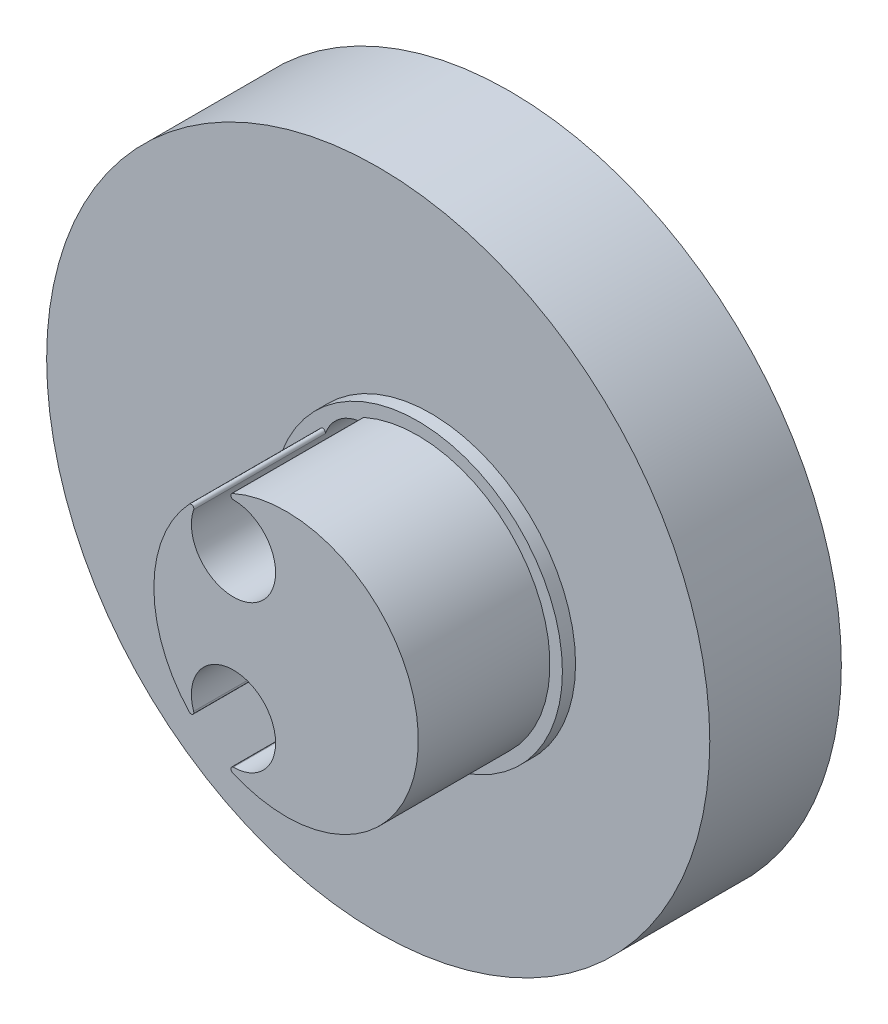
ISO-10303-21;
HEADER;
FILE_DESCRIPTION(('STEP AP214'),'2;1');
FILE_NAME('part.step','',(''),(''),'','','');
FILE_SCHEMA(('AUTOMOTIVE_DESIGN { 1 0 10303 214 1 1 1 1 }'));
ENDSEC;
DATA;
#1=APPLICATION_CONTEXT('core data for automotive mechanical design processes');
#2=APPLICATION_PROTOCOL_DEFINITION('international standard','automotive_design',2000,#1);
#3=PRODUCT_CONTEXT('',#1,'mechanical');
#4=PRODUCT('Part','Part','',(#3));
#5=PRODUCT_RELATED_PRODUCT_CATEGORY('part','',(#4));
#6=PRODUCT_DEFINITION_FORMATION('','',#4);
#7=PRODUCT_DEFINITION_CONTEXT('part definition',#1,'design');
#8=PRODUCT_DEFINITION('design','',#6,#7);
#9=PRODUCT_DEFINITION_SHAPE('','',#8);
#10=(LENGTH_UNIT() NAMED_UNIT(*) SI_UNIT(.MILLI.,.METRE.));
#11=(NAMED_UNIT(*) PLANE_ANGLE_UNIT() SI_UNIT($,.RADIAN.));
#12=(NAMED_UNIT(*) SI_UNIT($,.STERADIAN.) SOLID_ANGLE_UNIT());
#13=UNCERTAINTY_MEASURE_WITH_UNIT(LENGTH_MEASURE(1.E-05),#10,'distance_accuracy_value','');
#14=(GEOMETRIC_REPRESENTATION_CONTEXT(3) GLOBAL_UNCERTAINTY_ASSIGNED_CONTEXT((#13)) GLOBAL_UNIT_ASSIGNED_CONTEXT((#10,
#11,#12)) REPRESENTATION_CONTEXT('',''));
#15=CARTESIAN_POINT('',(0.,0.,0.));
#16=DIRECTION('',(0.,0.,1.));
#17=DIRECTION('',(1.,0.,0.));
#18=AXIS2_PLACEMENT_3D('',#15,#16,#17);
#19=CARTESIAN_POINT('',(0.,0.,8.5));
#20=DIRECTION('',(0.,0.,1.));
#21=DIRECTION('',(1.,0.,0.));
#22=AXIS2_PLACEMENT_3D('',#19,#20,#21);
#23=PLANE('',#22);
#24=CARTESIAN_POINT('',(0.,-2.8,8.5));
#25=DIRECTION('',(0.,0.,1.));
#26=DIRECTION('',(1.,0.,0.));
#27=AXIS2_PLACEMENT_3D('',#24,#25,#26);
#28=CIRCLE('',#27,1.6);
#29=CARTESIAN_POINT('',(-1.51308349346044,-3.32017145425094,8.5));
#30=VERTEX_POINT('',#29);
#31=CARTESIAN_POINT('',(-0.00132429668263966,-4.39999945194937,8.5));
#32=VERTEX_POINT('',#31);
#33=EDGE_CURVE('E152',#30,#32,#28,.F.);
#34=ORIENTED_EDGE('',*,*,#33,.T.);
#35=CARTESIAN_POINT('',(-0.00140706522530469,-4.49999941769621,8.5));
#36=DIRECTION('',(0.,0.,1.));
#37=DIRECTION('',(1.,0.,0.));
#38=AXIS2_PLACEMENT_3D('',#35,#36,#37);
#39=CIRCLE('',#38,0.1);
#40=CARTESIAN_POINT('',(-0.0420447721334329,-4.59136996424842,8.5));
#41=VERTEX_POINT('',#40);
#42=EDGE_CURVE('E166',#32,#41,#39,.T.);
#43=ORIENTED_EDGE('',*,*,#42,.T.);
#44=CARTESIAN_POINT('',(2.,0.,8.5));
#45=DIRECTION('',(0.,0.,1.));
#46=DIRECTION('',(1.,0.,0.));
#47=AXIS2_PLACEMENT_3D('',#44,#45,#46);
#48=CIRCLE('',#47,5.025);
#49=CARTESIAN_POINT('',(-0.0420447721334338,4.59136996424842,8.5));
#50=VERTEX_POINT('',#49);
#51=EDGE_CURVE('E121',#41,#50,#48,.T.);
#52=ORIENTED_EDGE('',*,*,#51,.T.);
#53=CARTESIAN_POINT('',(-0.00140706522530566,4.49999941769621,8.5));
#54=DIRECTION('',(0.,0.,1.));
#55=DIRECTION('',(1.,0.,0.));
#56=AXIS2_PLACEMENT_3D('',#53,#54,#55);
#57=CIRCLE('',#56,0.1);
#58=CARTESIAN_POINT('',(-0.00132429668264062,4.39999945194937,8.5));
#59=VERTEX_POINT('',#58);
#60=EDGE_CURVE('E162',#50,#59,#57,.T.);
#61=ORIENTED_EDGE('',*,*,#60,.T.);
#62=CARTESIAN_POINT('',(0.,2.8,8.5));
#63=DIRECTION('',(0.,0.,1.));
#64=DIRECTION('',(1.,0.,0.));
#65=AXIS2_PLACEMENT_3D('',#62,#63,#64);
#66=CIRCLE('',#65,1.6);
#67=CARTESIAN_POINT('',(-1.51308349346044,3.32017145425094,8.5));
#68=VERTEX_POINT('',#67);
#69=EDGE_CURVE('E149',#59,#68,#66,.F.);
#70=ORIENTED_EDGE('',*,*,#69,.T.);
#71=CARTESIAN_POINT('',(-1.60765121180172,3.35268217014163,8.5));
#72=DIRECTION('',(0.,0.,1.));
#73=DIRECTION('',(1.,0.,0.));
#74=AXIS2_PLACEMENT_3D('',#71,#72,#73);
#75=CIRCLE('',#74,0.1);
#76=CARTESIAN_POINT('',(-1.68090301305658,3.4207569350176,8.5));
#77=VERTEX_POINT('',#76);
#78=EDGE_CURVE('E160',#68,#77,#75,.T.);
#79=ORIENTED_EDGE('',*,*,#78,.T.);
#80=CARTESIAN_POINT('',(-1.68090301305658,-3.4207569350176,8.5));
#81=VERTEX_POINT('',#80);
#82=EDGE_CURVE('E146',#77,#81,#48,.T.);
#83=ORIENTED_EDGE('',*,*,#82,.T.);
#84=CARTESIAN_POINT('',(-1.60765121180172,-3.35268217014163,8.5));
#85=DIRECTION('',(0.,0.,1.));
#86=DIRECTION('',(1.,0.,0.));
#87=AXIS2_PLACEMENT_3D('',#84,#85,#86);
#88=CIRCLE('',#87,0.1);
#89=EDGE_CURVE('E164',#81,#30,#88,.T.);
#90=ORIENTED_EDGE('',*,*,#89,.T.);
#91=EDGE_LOOP('',(#34,#43,#52,#61,#70,#79,#83,#90));
#92=FACE_BOUND('',#91,.T.);
#93=ADVANCED_FACE('F41',(#92),#23,.T.);
#94=CARTESIAN_POINT('',(0.,0.,3.));
#95=DIRECTION('',(0.,0.,1.));
#96=DIRECTION('',(1.,0.,0.));
#97=AXIS2_PLACEMENT_3D('',#94,#95,#96);
#98=PLANE('',#97);
#99=CARTESIAN_POINT('',(2.,0.,3.));
#100=DIRECTION('',(0.,0.,1.));
#101=DIRECTION('',(1.,0.,0.));
#102=AXIS2_PLACEMENT_3D('',#99,#100,#101);
#103=CIRCLE('',#102,5.49945445757595);
#104=CARTESIAN_POINT('',(7.49945445757595,0.,3.));
#105=VERTEX_POINT('',#104);
#106=EDGE_CURVE('E128',#105,#105,#103,.T.);
#107=ORIENTED_EDGE('',*,*,#106,.F.);
#108=EDGE_LOOP('',(#107));
#109=FACE_BOUND('',#108,.T.);
#110=CARTESIAN_POINT('',(0.,0.,3.));
#111=DIRECTION('',(0.,0.,1.));
#112=DIRECTION('',(1.,0.,0.));
#113=AXIS2_PLACEMENT_3D('',#110,#111,#112);
#114=CIRCLE('',#113,12.6);
#115=CARTESIAN_POINT('',(12.6,0.,3.));
#116=VERTEX_POINT('',#115);
#117=EDGE_CURVE('E155',#116,#116,#114,.F.);
#118=ORIENTED_EDGE('',*,*,#117,.F.);
#119=EDGE_LOOP('',(#118));
#120=FACE_BOUND('',#119,.T.);
#121=ADVANCED_FACE('F205',(#109,#120),#98,.T.);
#122=CARTESIAN_POINT('',(2.,0.,3.5));
#123=DIRECTION('',(0.,0.,-1.));
#124=DIRECTION('',(-1.,0.,0.));
#125=AXIS2_PLACEMENT_3D('',#122,#123,#124);
#126=CYLINDRICAL_SURFACE('',#125,5.49945445757595);
#127=CARTESIAN_POINT('',(2.,0.,3.5));
#128=DIRECTION('',(0.,0.,1.));
#129=DIRECTION('',(1.,0.,0.));
#130=AXIS2_PLACEMENT_3D('',#127,#128,#129);
#131=CIRCLE('',#130,5.49945445757595);
#132=CARTESIAN_POINT('',(7.49945445757595,0.,3.5));
#133=VERTEX_POINT('',#132);
#134=EDGE_CURVE('E134',#133,#133,#131,.T.);
#135=ORIENTED_EDGE('',*,*,#134,.F.);
#136=EDGE_LOOP('',(#135));
#137=FACE_BOUND('',#136,.T.);
#138=ORIENTED_EDGE('',*,*,#106,.T.);
#139=EDGE_LOOP('',(#138));
#140=FACE_BOUND('',#139,.T.);
#141=ADVANCED_FACE('F208',(#137,#140),#126,.T.);
#142=CARTESIAN_POINT('',(0.,0.,38.638181771802));
#143=DIRECTION('',(0.,0.,-1.));
#144=DIRECTION('',(-1.,0.,0.));
#145=AXIS2_PLACEMENT_3D('',#142,#143,#144);
#146=CYLINDRICAL_SURFACE('',#145,12.6);
#147=CARTESIAN_POINT('',(0.,0.,-2.));
#148=DIRECTION('',(0.,0.,-1.));
#149=DIRECTION('',(-1.,0.,0.));
#150=AXIS2_PLACEMENT_3D('',#147,#148,#149);
#151=CIRCLE('',#150,12.6);
#152=CARTESIAN_POINT('',(-12.6,0.,-2.));
#153=VERTEX_POINT('',#152);
#154=EDGE_CURVE('E329',#153,#153,#151,.T.);
#155=ORIENTED_EDGE('',*,*,#154,.F.);
#156=EDGE_LOOP('',(#155));
#157=FACE_BOUND('',#156,.T.);
#158=ORIENTED_EDGE('',*,*,#117,.T.);
#159=EDGE_LOOP('',(#158));
#160=FACE_BOUND('',#159,.T.);
#161=ADVANCED_FACE('F214',(#157,#160),#146,.T.);
#162=CARTESIAN_POINT('',(2.,0.,8.5));
#163=DIRECTION('',(0.,0.,-1.));
#164=DIRECTION('',(-1.,0.,0.));
#165=AXIS2_PLACEMENT_3D('',#162,#163,#164);
#166=CYLINDRICAL_SURFACE('',#165,5.025);
#167=CARTESIAN_POINT('',(2.,0.,3.5));
#168=DIRECTION('',(0.,0.,1.));
#169=DIRECTION('',(1.,0.,0.));
#170=AXIS2_PLACEMENT_3D('',#167,#168,#169);
#171=CIRCLE('',#170,5.025);
#172=CARTESIAN_POINT('',(-1.68090301305658,3.4207569350176,3.5));
#173=VERTEX_POINT('',#172);
#174=CARTESIAN_POINT('',(-1.68090301305658,-3.4207569350176,3.5));
#175=VERTEX_POINT('',#174);
#176=EDGE_CURVE('E129',#173,#175,#171,.T.);
#177=ORIENTED_EDGE('',*,*,#176,.T.);
#178=DIRECTION('',(0.,0.,-1.));
#179=VECTOR('',#178,1.);
#180=CARTESIAN_POINT('',(-1.68090301305658,-3.4207569350176,8.5));
#181=LINE('',#180,#179);
#182=EDGE_CURVE('E171',#175,#81,#181,.F.);
#183=ORIENTED_EDGE('',*,*,#182,.T.);
#184=ORIENTED_EDGE('',*,*,#82,.F.);
#185=DIRECTION('',(0.,0.,-1.));
#186=VECTOR('',#185,1.);
#187=CARTESIAN_POINT('',(-1.68090301305658,3.4207569350176,8.5));
#188=LINE('',#187,#186);
#189=EDGE_CURVE('E168',#77,#173,#188,.T.);
#190=ORIENTED_EDGE('',*,*,#189,.T.);
#191=EDGE_LOOP('',(#177,#183,#184,#190));
#192=FACE_BOUND('',#191,.T.);
#193=ADVANCED_FACE('F183',(#192),#166,.T.);
#194=CARTESIAN_POINT('',(0.,0.,3.5));
#195=DIRECTION('',(0.,0.,1.));
#196=DIRECTION('',(1.,0.,0.));
#197=AXIS2_PLACEMENT_3D('',#194,#195,#196);
#198=PLANE('',#197);
#199=CARTESIAN_POINT('',(0.,2.8,3.5));
#200=DIRECTION('',(0.,0.,1.));
#201=DIRECTION('',(1.,0.,0.));
#202=AXIS2_PLACEMENT_3D('',#199,#200,#201);
#203=CIRCLE('',#202,1.6);
#204=CARTESIAN_POINT('',(-0.00132429668264062,4.39999945194937,3.5));
#205=VERTEX_POINT('',#204);
#206=CARTESIAN_POINT('',(-1.51308349346044,3.32017145425094,3.5));
#207=VERTEX_POINT('',#206);
#208=EDGE_CURVE('E55',#205,#207,#203,.T.);
#209=ORIENTED_EDGE('',*,*,#208,.F.);
#210=CARTESIAN_POINT('',(-0.00140706522530566,4.49999941769621,3.5));
#211=DIRECTION('',(0.,0.,1.));
#212=DIRECTION('',(1.,0.,0.));
#213=AXIS2_PLACEMENT_3D('',#210,#211,#212);
#214=CIRCLE('',#213,0.1);
#215=CARTESIAN_POINT('',(-0.0420447721334338,4.59136996424842,3.5));
#216=VERTEX_POINT('',#215);
#217=EDGE_CURVE('E49',#205,#216,#214,.F.);
#218=ORIENTED_EDGE('',*,*,#217,.T.);
#219=CARTESIAN_POINT('',(-0.0420447721334329,-4.59136996424842,3.5));
#220=VERTEX_POINT('',#219);
#221=EDGE_CURVE('E118',#220,#216,#171,.T.);
#222=ORIENTED_EDGE('',*,*,#221,.F.);
#223=CARTESIAN_POINT('',(-0.00140706522530469,-4.49999941769621,3.5));
#224=DIRECTION('',(0.,0.,1.));
#225=DIRECTION('',(1.,0.,0.));
#226=AXIS2_PLACEMENT_3D('',#223,#224,#225);
#227=CIRCLE('',#226,0.1);
#228=CARTESIAN_POINT('',(-0.00132429668263966,-4.39999945194937,3.5));
#229=VERTEX_POINT('',#228);
#230=EDGE_CURVE('E103',#220,#229,#227,.F.);
#231=ORIENTED_EDGE('',*,*,#230,.T.);
#232=CARTESIAN_POINT('',(0.,-2.8,3.5));
#233=DIRECTION('',(0.,0.,1.));
#234=DIRECTION('',(1.,0.,0.));
#235=AXIS2_PLACEMENT_3D('',#232,#233,#234);
#236=CIRCLE('',#235,1.6);
#237=CARTESIAN_POINT('',(-1.51308349346044,-3.32017145425094,3.5));
#238=VERTEX_POINT('',#237);
#239=EDGE_CURVE('E138',#238,#229,#236,.T.);
#240=ORIENTED_EDGE('',*,*,#239,.F.);
#241=CARTESIAN_POINT('',(-1.60765121180172,-3.35268217014163,3.5));
#242=DIRECTION('',(0.,0.,1.));
#243=DIRECTION('',(1.,0.,0.));
#244=AXIS2_PLACEMENT_3D('',#241,#242,#243);
#245=CIRCLE('',#244,0.1);
#246=EDGE_CURVE('E110',#238,#175,#245,.F.);
#247=ORIENTED_EDGE('',*,*,#246,.T.);
#248=ORIENTED_EDGE('',*,*,#176,.F.);
#249=CARTESIAN_POINT('',(-1.60765121180172,3.35268217014163,3.5));
#250=DIRECTION('',(0.,0.,1.));
#251=DIRECTION('',(1.,0.,0.));
#252=AXIS2_PLACEMENT_3D('',#249,#250,#251);
#253=CIRCLE('',#252,0.1);
#254=EDGE_CURVE('E11',#173,#207,#253,.F.);
#255=ORIENTED_EDGE('',*,*,#254,.T.);
#256=EDGE_LOOP('',(#209,#218,#222,#231,#240,#247,#248,#255));
#257=FACE_BOUND('',#256,.T.);
#258=ORIENTED_EDGE('',*,*,#134,.T.);
#259=EDGE_LOOP('',(#258));
#260=FACE_BOUND('',#259,.T.);
#261=ADVANCED_FACE('F125',(#257,#260),#198,.T.);
#262=ORIENTED_EDGE('',*,*,#51,.F.);
#263=DIRECTION('',(0.,0.,-1.));
#264=VECTOR('',#263,1.);
#265=CARTESIAN_POINT('',(-0.0420447721334329,-4.59136996424842,8.5));
#266=LINE('',#265,#264);
#267=EDGE_CURVE('E107',#41,#220,#266,.T.);
#268=ORIENTED_EDGE('',*,*,#267,.T.);
#269=ORIENTED_EDGE('',*,*,#221,.T.);
#270=DIRECTION('',(0.,0.,-1.));
#271=VECTOR('',#270,1.);
#272=CARTESIAN_POINT('',(-0.0420447721334338,4.59136996424842,8.5));
#273=LINE('',#272,#271);
#274=EDGE_CURVE('E123',#216,#50,#273,.F.);
#275=ORIENTED_EDGE('',*,*,#274,.T.);
#276=EDGE_LOOP('',(#262,#268,#269,#275));
#277=FACE_BOUND('',#276,.T.);
#278=ADVANCED_FACE('F116',(#277),#166,.T.);
#279=CARTESIAN_POINT('',(0.,0.,-2.));
#280=DIRECTION('',(0.,0.,-1.));
#281=DIRECTION('',(-1.,0.,0.));
#282=AXIS2_PLACEMENT_3D('',#279,#280,#281);
#283=PLANE('',#282);
#284=CARTESIAN_POINT('',(0.,2.8,-2.));
#285=DIRECTION('',(0.,0.,1.));
#286=DIRECTION('',(1.,0.,0.));
#287=AXIS2_PLACEMENT_3D('',#284,#285,#286);
#288=CIRCLE('',#287,1.6);
#289=CARTESIAN_POINT('',(1.6,2.8,-2.));
#290=VERTEX_POINT('',#289);
#291=EDGE_CURVE('E140',#290,#290,#288,.T.);
#292=ORIENTED_EDGE('',*,*,#291,.T.);
#293=EDGE_LOOP('',(#292));
#294=FACE_BOUND('',#293,.T.);
#295=CARTESIAN_POINT('',(0.,-2.8,-2.));
#296=DIRECTION('',(0.,0.,1.));
#297=DIRECTION('',(1.,0.,0.));
#298=AXIS2_PLACEMENT_3D('',#295,#296,#297);
#299=CIRCLE('',#298,1.6);
#300=CARTESIAN_POINT('',(1.6,-2.8,-2.));
#301=VERTEX_POINT('',#300);
#302=EDGE_CURVE('E141',#301,#301,#299,.T.);
#303=ORIENTED_EDGE('',*,*,#302,.T.);
#304=EDGE_LOOP('',(#303));
#305=FACE_BOUND('',#304,.T.);
#306=ORIENTED_EDGE('',*,*,#154,.T.);
#307=EDGE_LOOP('',(#306));
#308=FACE_BOUND('',#307,.T.);
#309=ADVANCED_FACE('F200',(#294,#305,#308),#283,.T.);
#310=CARTESIAN_POINT('',(0.,2.8,-2.));
#311=DIRECTION('',(0.,0.,1.));
#312=DIRECTION('',(1.,0.,0.));
#313=AXIS2_PLACEMENT_3D('',#310,#311,#312);
#314=CYLINDRICAL_SURFACE('',#313,1.6);
#315=ORIENTED_EDGE('',*,*,#291,.F.);
#316=EDGE_LOOP('',(#315));
#317=FACE_BOUND('',#316,.T.);
#318=ORIENTED_EDGE('',*,*,#69,.F.);
#319=DIRECTION('',(0.,0.,1.));
#320=VECTOR('',#319,1.);
#321=CARTESIAN_POINT('',(-0.00132429668264062,4.39999945194937,-2.));
#322=LINE('',#321,#320);
#323=EDGE_CURVE('E111',#59,#205,#322,.F.);
#324=ORIENTED_EDGE('',*,*,#323,.T.);
#325=ORIENTED_EDGE('',*,*,#208,.T.);
#326=DIRECTION('',(0.,0.,1.));
#327=VECTOR('',#326,1.);
#328=CARTESIAN_POINT('',(-1.51308349346044,3.32017145425094,-2.));
#329=LINE('',#328,#327);
#330=EDGE_CURVE('E174',#207,#68,#329,.T.);
#331=ORIENTED_EDGE('',*,*,#330,.T.);
#332=EDGE_LOOP('',(#318,#324,#325,#331));
#333=FACE_BOUND('',#332,.T.);
#334=ADVANCED_FACE('F192',(#317,#333),#314,.F.);
#335=CARTESIAN_POINT('',(0.,-2.8,-2.));
#336=DIRECTION('',(0.,0.,1.));
#337=DIRECTION('',(1.,0.,0.));
#338=AXIS2_PLACEMENT_3D('',#335,#336,#337);
#339=CYLINDRICAL_SURFACE('',#338,1.6);
#340=ORIENTED_EDGE('',*,*,#302,.F.);
#341=EDGE_LOOP('',(#340));
#342=FACE_BOUND('',#341,.T.);
#343=ORIENTED_EDGE('',*,*,#239,.T.);
#344=DIRECTION('',(0.,0.,1.));
#345=VECTOR('',#344,1.);
#346=CARTESIAN_POINT('',(-0.00132429668263966,-4.39999945194937,-2.));
#347=LINE('',#346,#345);
#348=EDGE_CURVE('E108',#229,#32,#347,.T.);
#349=ORIENTED_EDGE('',*,*,#348,.T.);
#350=ORIENTED_EDGE('',*,*,#33,.F.);
#351=DIRECTION('',(0.,0.,1.));
#352=VECTOR('',#351,1.);
#353=CARTESIAN_POINT('',(-1.51308349346044,-3.32017145425094,-2.));
#354=LINE('',#353,#352);
#355=EDGE_CURVE('E122',#30,#238,#354,.F.);
#356=ORIENTED_EDGE('',*,*,#355,.T.);
#357=EDGE_LOOP('',(#343,#349,#350,#356));
#358=FACE_BOUND('',#357,.T.);
#359=ADVANCED_FACE('F190',(#342,#358),#339,.F.);
#360=CARTESIAN_POINT('',(-0.00140706522530469,-4.49999941769621,-2.));
#361=DIRECTION('',(0.,0.,1.));
#362=DIRECTION('',(1.,0.,0.));
#363=AXIS2_PLACEMENT_3D('',#360,#361,#362);
#364=CYLINDRICAL_SURFACE('',#363,0.1);
#365=ORIENTED_EDGE('',*,*,#42,.F.);
#366=ORIENTED_EDGE('',*,*,#348,.F.);
#367=ORIENTED_EDGE('',*,*,#230,.F.);
#368=ORIENTED_EDGE('',*,*,#267,.F.);
#369=EDGE_LOOP('',(#365,#366,#367,#368));
#370=FACE_BOUND('',#369,.T.);
#371=ADVANCED_FACE('F106',(#370),#364,.T.);
#372=CARTESIAN_POINT('',(-1.60765121180172,-3.35268217014163,-2.));
#373=DIRECTION('',(0.,0.,-1.));
#374=DIRECTION('',(-1.,0.,0.));
#375=AXIS2_PLACEMENT_3D('',#372,#373,#374);
#376=CYLINDRICAL_SURFACE('',#375,0.1);
#377=ORIENTED_EDGE('',*,*,#246,.F.);
#378=ORIENTED_EDGE('',*,*,#355,.F.);
#379=ORIENTED_EDGE('',*,*,#89,.F.);
#380=ORIENTED_EDGE('',*,*,#182,.F.);
#381=EDGE_LOOP('',(#377,#378,#379,#380));
#382=FACE_BOUND('',#381,.T.);
#383=ADVANCED_FACE('F186',(#382),#376,.T.);
#384=CARTESIAN_POINT('',(-0.00140706522530566,4.49999941769621,-2.));
#385=DIRECTION('',(0.,0.,-1.));
#386=DIRECTION('',(-1.,0.,0.));
#387=AXIS2_PLACEMENT_3D('',#384,#385,#386);
#388=CYLINDRICAL_SURFACE('',#387,0.1);
#389=ORIENTED_EDGE('',*,*,#217,.F.);
#390=ORIENTED_EDGE('',*,*,#323,.F.);
#391=ORIENTED_EDGE('',*,*,#60,.F.);
#392=ORIENTED_EDGE('',*,*,#274,.F.);
#393=EDGE_LOOP('',(#389,#390,#391,#392));
#394=FACE_BOUND('',#393,.T.);
#395=ADVANCED_FACE('F266',(#394),#388,.T.);
#396=CARTESIAN_POINT('',(-1.60765121180172,3.35268217014163,-2.));
#397=DIRECTION('',(0.,0.,1.));
#398=DIRECTION('',(1.,0.,0.));
#399=AXIS2_PLACEMENT_3D('',#396,#397,#398);
#400=CYLINDRICAL_SURFACE('',#399,0.1);
#401=ORIENTED_EDGE('',*,*,#78,.F.);
#402=ORIENTED_EDGE('',*,*,#330,.F.);
#403=ORIENTED_EDGE('',*,*,#254,.F.);
#404=ORIENTED_EDGE('',*,*,#189,.F.);
#405=EDGE_LOOP('',(#401,#402,#403,#404));
#406=FACE_BOUND('',#405,.T.);
#407=ADVANCED_FACE('F43',(#406),#400,.T.);
#408=CLOSED_SHELL('',(#93,#121,#141,#161,#193,#261,#278,#309,#334,#359,#371,#383,#395,#407));
#409=MANIFOLD_SOLID_BREP('B2',#408);
#410=ADVANCED_BREP_SHAPE_REPRESENTATION('',(#18,#409),#14);
#411=SHAPE_DEFINITION_REPRESENTATION(#9,#410);
ENDSEC;
END-ISO-10303-21;
